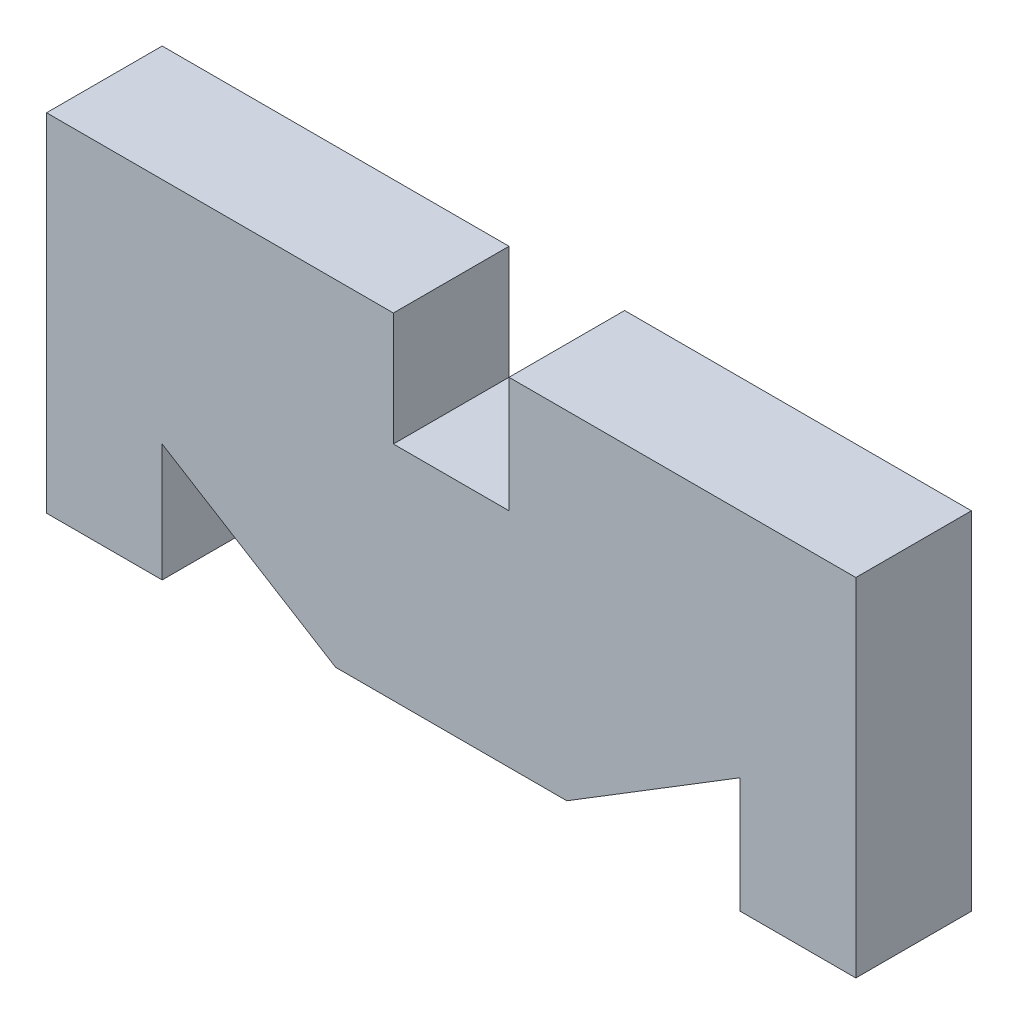
ISO-10303-21;
HEADER;
FILE_DESCRIPTION(('STEP AP214'),'2;1');
FILE_NAME('part.step','',(''),(''),'','','');
FILE_SCHEMA(('AUTOMOTIVE_DESIGN { 1 0 10303 214 1 1 1 1 }'));
ENDSEC;
DATA;
#1=APPLICATION_CONTEXT('core data for automotive mechanical design processes');
#2=APPLICATION_PROTOCOL_DEFINITION('international standard','automotive_design',2000,#1);
#3=PRODUCT_CONTEXT('',#1,'mechanical');
#4=PRODUCT('Part','Part','',(#3));
#5=PRODUCT_RELATED_PRODUCT_CATEGORY('part','',(#4));
#6=PRODUCT_DEFINITION_FORMATION('','',#4);
#7=PRODUCT_DEFINITION_CONTEXT('part definition',#1,'design');
#8=PRODUCT_DEFINITION('design','',#6,#7);
#9=PRODUCT_DEFINITION_SHAPE('','',#8);
#10=(LENGTH_UNIT() NAMED_UNIT(*) SI_UNIT(.MILLI.,.METRE.));
#11=(NAMED_UNIT(*) PLANE_ANGLE_UNIT() SI_UNIT($,.RADIAN.));
#12=(NAMED_UNIT(*) SI_UNIT($,.STERADIAN.) SOLID_ANGLE_UNIT());
#13=UNCERTAINTY_MEASURE_WITH_UNIT(LENGTH_MEASURE(1.E-05),#10,'distance_accuracy_value','');
#14=(GEOMETRIC_REPRESENTATION_CONTEXT(3) GLOBAL_UNCERTAINTY_ASSIGNED_CONTEXT((#13)) GLOBAL_UNIT_ASSIGNED_CONTEXT((#10,
#11,#12)) REPRESENTATION_CONTEXT('',''));
#15=CARTESIAN_POINT('',(0.,0.,0.));
#16=DIRECTION('',(0.,0.,1.));
#17=DIRECTION('',(1.,0.,0.));
#18=AXIS2_PLACEMENT_3D('',#15,#16,#17);
#19=CARTESIAN_POINT('',(1.84845443306429,-6.2813351961484,10.));
#20=DIRECTION('',(1.,0.,0.));
#21=DIRECTION('',(0.,0.,-1.));
#22=AXIS2_PLACEMENT_3D('',#19,#20,#21);
#23=PLANE('',#22);
#24=DIRECTION('',(0.,-1.,0.));
#25=VECTOR('',#24,1.);
#26=CARTESIAN_POINT('',(1.84845443306429,-6.2813351961484,0.));
#27=LINE('',#26,#25);
#28=CARTESIAN_POINT('',(1.84845443306429,23.7186648038516,0.));
#29=VERTEX_POINT('',#28);
#30=CARTESIAN_POINT('',(1.84845443306429,-6.2813351961484,0.));
#31=VERTEX_POINT('',#30);
#32=EDGE_CURVE('E173',#29,#31,#27,.T.);
#33=ORIENTED_EDGE('',*,*,#32,.T.);
#34=DIRECTION('',(0.,0.,-1.));
#35=VECTOR('',#34,1.);
#36=CARTESIAN_POINT('',(1.84845443306429,-6.2813351961484,10.));
#37=LINE('',#36,#35);
#38=CARTESIAN_POINT('',(1.84845443306429,-6.2813351961484,10.));
#39=VERTEX_POINT('',#38);
#40=EDGE_CURVE('E11',#39,#31,#37,.T.);
#41=ORIENTED_EDGE('',*,*,#40,.F.);
#42=DIRECTION('',(0.,-1.,0.));
#43=VECTOR('',#42,1.);
#44=CARTESIAN_POINT('',(1.84845443306429,-6.2813351961484,10.));
#45=LINE('',#44,#43);
#46=CARTESIAN_POINT('',(1.84845443306429,23.7186648038516,10.));
#47=VERTEX_POINT('',#46);
#48=EDGE_CURVE('E197',#47,#39,#45,.T.);
#49=ORIENTED_EDGE('',*,*,#48,.F.);
#50=DIRECTION('',(0.,0.,-1.));
#51=VECTOR('',#50,1.);
#52=CARTESIAN_POINT('',(1.84845443306429,23.7186648038516,10.));
#53=LINE('',#52,#51);
#54=EDGE_CURVE('E167',#47,#29,#53,.T.);
#55=ORIENTED_EDGE('',*,*,#54,.T.);
#56=EDGE_LOOP('',(#33,#41,#49,#55));
#57=FACE_BOUND('',#56,.T.);
#58=ADVANCED_FACE('F39',(#57),#23,.F.);
#59=CARTESIAN_POINT('',(11.8484544330643,-6.2813351961484,10.));
#60=DIRECTION('',(0.,1.,0.));
#61=DIRECTION('',(-1.,0.,0.));
#62=AXIS2_PLACEMENT_3D('',#59,#60,#61);
#63=PLANE('',#62);
#64=DIRECTION('',(1.,0.,0.));
#65=VECTOR('',#64,1.);
#66=CARTESIAN_POINT('',(11.8484544330643,-6.2813351961484,0.));
#67=LINE('',#66,#65);
#68=CARTESIAN_POINT('',(11.8484544330643,-6.2813351961484,0.));
#69=VERTEX_POINT('',#68);
#70=EDGE_CURVE('E174',#31,#69,#67,.T.);
#71=ORIENTED_EDGE('',*,*,#70,.T.);
#72=DIRECTION('',(0.,0.,-1.));
#73=VECTOR('',#72,1.);
#74=CARTESIAN_POINT('',(11.8484544330643,-6.2813351961484,10.));
#75=LINE('',#74,#73);
#76=CARTESIAN_POINT('',(11.8484544330643,-6.2813351961484,10.));
#77=VERTEX_POINT('',#76);
#78=EDGE_CURVE('E50',#77,#69,#75,.T.);
#79=ORIENTED_EDGE('',*,*,#78,.F.);
#80=DIRECTION('',(1.,0.,0.));
#81=VECTOR('',#80,1.);
#82=CARTESIAN_POINT('',(11.8484544330643,-6.2813351961484,10.));
#83=LINE('',#82,#81);
#84=EDGE_CURVE('E116',#39,#77,#83,.T.);
#85=ORIENTED_EDGE('',*,*,#84,.F.);
#86=ORIENTED_EDGE('',*,*,#40,.T.);
#87=EDGE_LOOP('',(#71,#79,#85,#86));
#88=FACE_BOUND('',#87,.T.);
#89=ADVANCED_FACE('F283',(#88),#63,.F.);
#90=CARTESIAN_POINT('',(11.8484544330643,3.90407855986979,10.));
#91=DIRECTION('',(-1.,0.,0.));
#92=DIRECTION('',(0.,-1.,0.));
#93=AXIS2_PLACEMENT_3D('',#90,#91,#92);
#94=PLANE('',#93);
#95=DIRECTION('',(0.,1.,0.));
#96=VECTOR('',#95,1.);
#97=CARTESIAN_POINT('',(11.8484544330643,3.90407855986979,0.));
#98=LINE('',#97,#96);
#99=CARTESIAN_POINT('',(11.8484544330643,3.90407855986979,0.));
#100=VERTEX_POINT('',#99);
#101=EDGE_CURVE('E176',#69,#100,#98,.T.);
#102=ORIENTED_EDGE('',*,*,#101,.T.);
#103=DIRECTION('',(0.,0.,-1.));
#104=VECTOR('',#103,1.);
#105=CARTESIAN_POINT('',(11.8484544330643,3.90407855986979,10.));
#106=LINE('',#105,#104);
#107=CARTESIAN_POINT('',(11.8484544330643,3.90407855986979,10.));
#108=VERTEX_POINT('',#107);
#109=EDGE_CURVE('E225',#108,#100,#106,.T.);
#110=ORIENTED_EDGE('',*,*,#109,.F.);
#111=DIRECTION('',(0.,1.,0.));
#112=VECTOR('',#111,1.);
#113=CARTESIAN_POINT('',(11.8484544330643,3.90407855986979,10.));
#114=LINE('',#113,#112);
#115=EDGE_CURVE('E229',#77,#108,#114,.T.);
#116=ORIENTED_EDGE('',*,*,#115,.F.);
#117=ORIENTED_EDGE('',*,*,#78,.T.);
#118=EDGE_LOOP('',(#102,#110,#116,#117));
#119=FACE_BOUND('',#118,.T.);
#120=ADVANCED_FACE('F228',(#119),#94,.F.);
#121=CARTESIAN_POINT('',(26.8484544330643,-5.32163250947317,10.));
#122=DIRECTION('',(0.523889074635762,0.851786497590379,0.));
#123=DIRECTION('',(-0.851786497590379,0.523889074635762,0.));
#124=AXIS2_PLACEMENT_3D('',#121,#122,#123);
#125=PLANE('',#124);
#126=DIRECTION('',(0.851786497590379,-0.523889074635762,0.));
#127=VECTOR('',#126,1.);
#128=CARTESIAN_POINT('',(26.8484544330643,-5.32163250947317,0.));
#129=LINE('',#128,#127);
#130=CARTESIAN_POINT('',(26.8484544330643,-5.32163250947317,0.));
#131=VERTEX_POINT('',#130);
#132=EDGE_CURVE('E178',#100,#131,#129,.T.);
#133=ORIENTED_EDGE('',*,*,#132,.T.);
#134=DIRECTION('',(0.,0.,-1.));
#135=VECTOR('',#134,1.);
#136=CARTESIAN_POINT('',(26.8484544330643,-5.32163250947317,10.));
#137=LINE('',#136,#135);
#138=CARTESIAN_POINT('',(26.8484544330643,-5.32163250947317,10.));
#139=VERTEX_POINT('',#138);
#140=EDGE_CURVE('E219',#139,#131,#137,.T.);
#141=ORIENTED_EDGE('',*,*,#140,.F.);
#142=DIRECTION('',(0.851786497590379,-0.523889074635762,0.));
#143=VECTOR('',#142,1.);
#144=CARTESIAN_POINT('',(26.8484544330643,-5.32163250947317,10.));
#145=LINE('',#144,#143);
#146=EDGE_CURVE('E246',#108,#139,#145,.T.);
#147=ORIENTED_EDGE('',*,*,#146,.F.);
#148=ORIENTED_EDGE('',*,*,#109,.T.);
#149=EDGE_LOOP('',(#133,#141,#147,#148));
#150=FACE_BOUND('',#149,.T.);
#151=ADVANCED_FACE('F236',(#150),#125,.F.);
#152=CARTESIAN_POINT('',(46.8484544330643,-5.32163250947316,10.));
#153=DIRECTION('',(0.,1.,0.));
#154=DIRECTION('',(-1.,0.,0.));
#155=AXIS2_PLACEMENT_3D('',#152,#153,#154);
#156=PLANE('',#155);
#157=DIRECTION('',(1.,0.,0.));
#158=VECTOR('',#157,1.);
#159=CARTESIAN_POINT('',(46.8484544330643,-5.32163250947316,0.));
#160=LINE('',#159,#158);
#161=CARTESIAN_POINT('',(46.8484544330643,-5.32163250947316,0.));
#162=VERTEX_POINT('',#161);
#163=EDGE_CURVE('E179',#131,#162,#160,.T.);
#164=ORIENTED_EDGE('',*,*,#163,.T.);
#165=DIRECTION('',(0.,0.,-1.));
#166=VECTOR('',#165,1.);
#167=CARTESIAN_POINT('',(46.8484544330643,-5.32163250947316,10.));
#168=LINE('',#167,#166);
#169=CARTESIAN_POINT('',(46.8484544330643,-5.32163250947316,10.));
#170=VERTEX_POINT('',#169);
#171=EDGE_CURVE('E218',#170,#162,#168,.T.);
#172=ORIENTED_EDGE('',*,*,#171,.F.);
#173=DIRECTION('',(1.,0.,0.));
#174=VECTOR('',#173,1.);
#175=CARTESIAN_POINT('',(46.8484544330643,-5.32163250947316,10.));
#176=LINE('',#175,#174);
#177=EDGE_CURVE('E245',#139,#170,#176,.T.);
#178=ORIENTED_EDGE('',*,*,#177,.F.);
#179=ORIENTED_EDGE('',*,*,#140,.T.);
#180=EDGE_LOOP('',(#164,#172,#178,#179));
#181=FACE_BOUND('',#180,.T.);
#182=ADVANCED_FACE('F244',(#181),#156,.F.);
#183=CARTESIAN_POINT('',(61.8484544330643,3.90407855986973,10.));
#184=DIRECTION('',(-0.523889074635759,0.851786497590381,0.));
#185=DIRECTION('',(-0.851786497590381,-0.523889074635759,0.));
#186=AXIS2_PLACEMENT_3D('',#183,#184,#185);
#187=PLANE('',#186);
#188=DIRECTION('',(0.851786497590381,0.523889074635759,0.));
#189=VECTOR('',#188,1.);
#190=CARTESIAN_POINT('',(61.8484544330643,3.90407855986973,0.));
#191=LINE('',#190,#189);
#192=CARTESIAN_POINT('',(61.8484544330643,3.90407855986973,0.));
#193=VERTEX_POINT('',#192);
#194=EDGE_CURVE('E185',#162,#193,#191,.T.);
#195=ORIENTED_EDGE('',*,*,#194,.T.);
#196=DIRECTION('',(0.,0.,-1.));
#197=VECTOR('',#196,1.);
#198=CARTESIAN_POINT('',(61.8484544330643,3.90407855986973,10.));
#199=LINE('',#198,#197);
#200=CARTESIAN_POINT('',(61.8484544330643,3.90407855986973,10.));
#201=VERTEX_POINT('',#200);
#202=EDGE_CURVE('E211',#201,#193,#199,.T.);
#203=ORIENTED_EDGE('',*,*,#202,.F.);
#204=DIRECTION('',(0.851786497590381,0.523889074635759,0.));
#205=VECTOR('',#204,1.);
#206=CARTESIAN_POINT('',(61.8484544330643,3.90407855986973,10.));
#207=LINE('',#206,#205);
#208=EDGE_CURVE('E250',#170,#201,#207,.T.);
#209=ORIENTED_EDGE('',*,*,#208,.F.);
#210=ORIENTED_EDGE('',*,*,#171,.T.);
#211=EDGE_LOOP('',(#195,#203,#209,#210));
#212=FACE_BOUND('',#211,.T.);
#213=ADVANCED_FACE('F299',(#212),#187,.F.);
#214=CARTESIAN_POINT('',(61.8484544330643,-6.09592144013027,10.));
#215=DIRECTION('',(1.,0.,0.));
#216=DIRECTION('',(0.,0.,-1.));
#217=AXIS2_PLACEMENT_3D('',#214,#215,#216);
#218=PLANE('',#217);
#219=DIRECTION('',(0.,-1.,0.));
#220=VECTOR('',#219,1.);
#221=CARTESIAN_POINT('',(61.8484544330643,-6.09592144013027,0.));
#222=LINE('',#221,#220);
#223=CARTESIAN_POINT('',(61.8484544330643,-6.09592144013027,0.));
#224=VERTEX_POINT('',#223);
#225=EDGE_CURVE('E182',#193,#224,#222,.T.);
#226=ORIENTED_EDGE('',*,*,#225,.T.);
#227=DIRECTION('',(0.,0.,-1.));
#228=VECTOR('',#227,1.);
#229=CARTESIAN_POINT('',(61.8484544330643,-6.09592144013027,10.));
#230=LINE('',#229,#228);
#231=CARTESIAN_POINT('',(61.8484544330643,-6.09592144013027,10.));
#232=VERTEX_POINT('',#231);
#233=EDGE_CURVE('E210',#232,#224,#230,.T.);
#234=ORIENTED_EDGE('',*,*,#233,.F.);
#235=DIRECTION('',(0.,-1.,0.));
#236=VECTOR('',#235,1.);
#237=CARTESIAN_POINT('',(61.8484544330643,-6.09592144013027,10.));
#238=LINE('',#237,#236);
#239=EDGE_CURVE('E248',#201,#232,#238,.T.);
#240=ORIENTED_EDGE('',*,*,#239,.F.);
#241=ORIENTED_EDGE('',*,*,#202,.T.);
#242=EDGE_LOOP('',(#226,#234,#240,#241));
#243=FACE_BOUND('',#242,.T.);
#244=ADVANCED_FACE('F303',(#243),#218,.F.);
#245=CARTESIAN_POINT('',(71.8484544330643,-6.09592144013027,10.));
#246=DIRECTION('',(0.,1.,0.));
#247=DIRECTION('',(-1.,0.,0.));
#248=AXIS2_PLACEMENT_3D('',#245,#246,#247);
#249=PLANE('',#248);
#250=DIRECTION('',(1.,0.,0.));
#251=VECTOR('',#250,1.);
#252=CARTESIAN_POINT('',(71.8484544330643,-6.09592144013027,0.));
#253=LINE('',#252,#251);
#254=CARTESIAN_POINT('',(71.8484544330643,-6.09592144013027,0.));
#255=VERTEX_POINT('',#254);
#256=EDGE_CURVE('E186',#224,#255,#253,.T.);
#257=ORIENTED_EDGE('',*,*,#256,.T.);
#258=DIRECTION('',(0.,0.,-1.));
#259=VECTOR('',#258,1.);
#260=CARTESIAN_POINT('',(71.8484544330643,-6.09592144013027,10.));
#261=LINE('',#260,#259);
#262=CARTESIAN_POINT('',(71.8484544330643,-6.09592144013027,10.));
#263=VERTEX_POINT('',#262);
#264=EDGE_CURVE('E207',#263,#255,#261,.T.);
#265=ORIENTED_EDGE('',*,*,#264,.F.);
#266=DIRECTION('',(1.,0.,0.));
#267=VECTOR('',#266,1.);
#268=CARTESIAN_POINT('',(71.8484544330643,-6.09592144013027,10.));
#269=LINE('',#268,#267);
#270=EDGE_CURVE('E258',#232,#263,#269,.T.);
#271=ORIENTED_EDGE('',*,*,#270,.F.);
#272=ORIENTED_EDGE('',*,*,#233,.T.);
#273=EDGE_LOOP('',(#257,#265,#271,#272));
#274=FACE_BOUND('',#273,.T.);
#275=ADVANCED_FACE('F304',(#274),#249,.F.);
#276=CARTESIAN_POINT('',(71.8484544330643,23.9040785598697,10.));
#277=DIRECTION('',(-1.,0.,0.));
#278=DIRECTION('',(0.,0.,1.));
#279=AXIS2_PLACEMENT_3D('',#276,#277,#278);
#280=PLANE('',#279);
#281=DIRECTION('',(0.,1.,0.));
#282=VECTOR('',#281,1.);
#283=CARTESIAN_POINT('',(71.8484544330643,23.9040785598697,0.));
#284=LINE('',#283,#282);
#285=CARTESIAN_POINT('',(71.8484544330643,23.9040785598697,0.));
#286=VERTEX_POINT('',#285);
#287=EDGE_CURVE('E187',#255,#286,#284,.T.);
#288=ORIENTED_EDGE('',*,*,#287,.T.);
#289=DIRECTION('',(0.,0.,-1.));
#290=VECTOR('',#289,1.);
#291=CARTESIAN_POINT('',(71.8484544330643,23.9040785598697,10.));
#292=LINE('',#291,#290);
#293=CARTESIAN_POINT('',(71.8484544330643,23.9040785598697,10.));
#294=VERTEX_POINT('',#293);
#295=EDGE_CURVE('E204',#294,#286,#292,.T.);
#296=ORIENTED_EDGE('',*,*,#295,.F.);
#297=DIRECTION('',(0.,1.,0.));
#298=VECTOR('',#297,1.);
#299=CARTESIAN_POINT('',(71.8484544330643,23.9040785598697,10.));
#300=LINE('',#299,#298);
#301=EDGE_CURVE('E256',#263,#294,#300,.T.);
#302=ORIENTED_EDGE('',*,*,#301,.F.);
#303=ORIENTED_EDGE('',*,*,#264,.T.);
#304=EDGE_LOOP('',(#288,#296,#302,#303));
#305=FACE_BOUND('',#304,.T.);
#306=ADVANCED_FACE('F309',(#305),#280,.F.);
#307=CARTESIAN_POINT('',(41.8484544330643,23.9040785598697,10.));
#308=DIRECTION('',(0.,-1.,0.));
#309=DIRECTION('',(1.,0.,0.));
#310=AXIS2_PLACEMENT_3D('',#307,#308,#309);
#311=PLANE('',#310);
#312=DIRECTION('',(-1.,0.,0.));
#313=VECTOR('',#312,1.);
#314=CARTESIAN_POINT('',(41.8484544330643,23.9040785598697,0.));
#315=LINE('',#314,#313);
#316=CARTESIAN_POINT('',(41.8484544330643,23.9040785598697,0.));
#317=VERTEX_POINT('',#316);
#318=EDGE_CURVE('E189',#286,#317,#315,.T.);
#319=ORIENTED_EDGE('',*,*,#318,.T.);
#320=DIRECTION('',(0.,0.,-1.));
#321=VECTOR('',#320,1.);
#322=CARTESIAN_POINT('',(41.8484544330643,23.9040785598697,10.));
#323=LINE('',#322,#321);
#324=CARTESIAN_POINT('',(41.8484544330643,23.9040785598697,10.));
#325=VERTEX_POINT('',#324);
#326=EDGE_CURVE('E202',#325,#317,#323,.T.);
#327=ORIENTED_EDGE('',*,*,#326,.F.);
#328=DIRECTION('',(-1.,0.,0.));
#329=VECTOR('',#328,1.);
#330=CARTESIAN_POINT('',(41.8484544330643,23.9040785598697,10.));
#331=LINE('',#330,#329);
#332=EDGE_CURVE('E259',#294,#325,#331,.T.);
#333=ORIENTED_EDGE('',*,*,#332,.F.);
#334=ORIENTED_EDGE('',*,*,#295,.T.);
#335=EDGE_LOOP('',(#319,#327,#333,#334));
#336=FACE_BOUND('',#335,.T.);
#337=ADVANCED_FACE('F266',(#336),#311,.F.);
#338=CARTESIAN_POINT('',(41.8484544330643,13.9040785598697,10.));
#339=DIRECTION('',(1.,0.,0.));
#340=DIRECTION('',(0.,1.,0.));
#341=AXIS2_PLACEMENT_3D('',#338,#339,#340);
#342=PLANE('',#341);
#343=DIRECTION('',(0.,-1.,0.));
#344=VECTOR('',#343,1.);
#345=CARTESIAN_POINT('',(41.8484544330643,13.9040785598697,0.));
#346=LINE('',#345,#344);
#347=CARTESIAN_POINT('',(41.8484544330643,13.9040785598697,0.));
#348=VERTEX_POINT('',#347);
#349=EDGE_CURVE('E195',#317,#348,#346,.T.);
#350=ORIENTED_EDGE('',*,*,#349,.T.);
#351=DIRECTION('',(0.,0.,-1.));
#352=VECTOR('',#351,1.);
#353=CARTESIAN_POINT('',(41.8484544330643,13.9040785598697,10.));
#354=LINE('',#353,#352);
#355=CARTESIAN_POINT('',(41.8484544330643,13.9040785598697,10.));
#356=VERTEX_POINT('',#355);
#357=EDGE_CURVE('E162',#356,#348,#354,.T.);
#358=ORIENTED_EDGE('',*,*,#357,.F.);
#359=DIRECTION('',(0.,-1.,0.));
#360=VECTOR('',#359,1.);
#361=CARTESIAN_POINT('',(41.8484544330643,13.9040785598697,10.));
#362=LINE('',#361,#360);
#363=EDGE_CURVE('E154',#325,#356,#362,.T.);
#364=ORIENTED_EDGE('',*,*,#363,.F.);
#365=ORIENTED_EDGE('',*,*,#326,.T.);
#366=EDGE_LOOP('',(#350,#358,#364,#365));
#367=FACE_BOUND('',#366,.T.);
#368=ADVANCED_FACE('F269',(#367),#342,.F.);
#369=CARTESIAN_POINT('',(31.8484544330643,13.9040785598697,10.));
#370=DIRECTION('',(0.,-1.,0.));
#371=DIRECTION('',(1.,0.,0.));
#372=AXIS2_PLACEMENT_3D('',#369,#370,#371);
#373=PLANE('',#372);
#374=DIRECTION('',(-1.,0.,0.));
#375=VECTOR('',#374,1.);
#376=CARTESIAN_POINT('',(31.8484544330643,13.9040785598697,0.));
#377=LINE('',#376,#375);
#378=CARTESIAN_POINT('',(31.8484544330643,13.9040785598697,0.));
#379=VERTEX_POINT('',#378);
#380=EDGE_CURVE('E161',#348,#379,#377,.T.);
#381=ORIENTED_EDGE('',*,*,#380,.T.);
#382=DIRECTION('',(0.,0.,-1.));
#383=VECTOR('',#382,1.);
#384=CARTESIAN_POINT('',(31.8484544330643,13.9040785598697,10.));
#385=LINE('',#384,#383);
#386=CARTESIAN_POINT('',(31.8484544330643,13.9040785598697,10.));
#387=VERTEX_POINT('',#386);
#388=EDGE_CURVE('E156',#387,#379,#385,.T.);
#389=ORIENTED_EDGE('',*,*,#388,.F.);
#390=DIRECTION('',(-1.,0.,0.));
#391=VECTOR('',#390,1.);
#392=CARTESIAN_POINT('',(31.8484544330643,13.9040785598697,10.));
#393=LINE('',#392,#391);
#394=EDGE_CURVE('E150',#356,#387,#393,.T.);
#395=ORIENTED_EDGE('',*,*,#394,.F.);
#396=ORIENTED_EDGE('',*,*,#357,.T.);
#397=EDGE_LOOP('',(#381,#389,#395,#396));
#398=FACE_BOUND('',#397,.T.);
#399=ADVANCED_FACE('F159',(#398),#373,.F.);
#400=CARTESIAN_POINT('',(31.8484544330643,23.7186648038516,10.));
#401=DIRECTION('',(-1.,0.,0.));
#402=DIRECTION('',(0.,-1.,0.));
#403=AXIS2_PLACEMENT_3D('',#400,#401,#402);
#404=PLANE('',#403);
#405=DIRECTION('',(0.,1.,0.));
#406=VECTOR('',#405,1.);
#407=CARTESIAN_POINT('',(31.8484544330643,23.7186648038516,0.));
#408=LINE('',#407,#406);
#409=CARTESIAN_POINT('',(31.8484544330643,23.7186648038516,0.));
#410=VERTEX_POINT('',#409);
#411=EDGE_CURVE('E105',#379,#410,#408,.T.);
#412=ORIENTED_EDGE('',*,*,#411,.T.);
#413=DIRECTION('',(0.,0.,-1.));
#414=VECTOR('',#413,1.);
#415=CARTESIAN_POINT('',(31.8484544330643,23.7186648038516,10.));
#416=LINE('',#415,#414);
#417=CARTESIAN_POINT('',(31.8484544330643,23.7186648038516,10.));
#418=VERTEX_POINT('',#417);
#419=EDGE_CURVE('E164',#418,#410,#416,.T.);
#420=ORIENTED_EDGE('',*,*,#419,.F.);
#421=DIRECTION('',(0.,1.,0.));
#422=VECTOR('',#421,1.);
#423=CARTESIAN_POINT('',(31.8484544330643,23.7186648038516,10.));
#424=LINE('',#423,#422);
#425=EDGE_CURVE('E151',#387,#418,#424,.T.);
#426=ORIENTED_EDGE('',*,*,#425,.F.);
#427=ORIENTED_EDGE('',*,*,#388,.T.);
#428=EDGE_LOOP('',(#412,#420,#426,#427));
#429=FACE_BOUND('',#428,.T.);
#430=ADVANCED_FACE('F165',(#429),#404,.F.);
#431=CARTESIAN_POINT('',(1.84845443306429,23.7186648038516,10.));
#432=DIRECTION('',(0.,-1.,0.));
#433=DIRECTION('',(1.,0.,0.));
#434=AXIS2_PLACEMENT_3D('',#431,#432,#433);
#435=PLANE('',#434);
#436=DIRECTION('',(-1.,0.,0.));
#437=VECTOR('',#436,1.);
#438=CARTESIAN_POINT('',(1.84845443306429,23.7186648038516,0.));
#439=LINE('',#438,#437);
#440=EDGE_CURVE('E109',#410,#29,#439,.T.);
#441=ORIENTED_EDGE('',*,*,#440,.T.);
#442=ORIENTED_EDGE('',*,*,#54,.F.);
#443=DIRECTION('',(-1.,0.,0.));
#444=VECTOR('',#443,1.);
#445=CARTESIAN_POINT('',(1.84845443306429,23.7186648038516,10.));
#446=LINE('',#445,#444);
#447=EDGE_CURVE('E54',#418,#47,#446,.T.);
#448=ORIENTED_EDGE('',*,*,#447,.F.);
#449=ORIENTED_EDGE('',*,*,#419,.T.);
#450=EDGE_LOOP('',(#441,#442,#448,#449));
#451=FACE_BOUND('',#450,.T.);
#452=ADVANCED_FACE('F272',(#451),#435,.F.);
#453=CARTESIAN_POINT('',(0.,0.,10.));
#454=DIRECTION('',(0.,0.,-1.));
#455=DIRECTION('',(-1.,0.,0.));
#456=AXIS2_PLACEMENT_3D('',#453,#454,#455);
#457=PLANE('',#456);
#458=ORIENTED_EDGE('',*,*,#48,.T.);
#459=ORIENTED_EDGE('',*,*,#84,.T.);
#460=ORIENTED_EDGE('',*,*,#115,.T.);
#461=ORIENTED_EDGE('',*,*,#146,.T.);
#462=ORIENTED_EDGE('',*,*,#177,.T.);
#463=ORIENTED_EDGE('',*,*,#208,.T.);
#464=ORIENTED_EDGE('',*,*,#239,.T.);
#465=ORIENTED_EDGE('',*,*,#270,.T.);
#466=ORIENTED_EDGE('',*,*,#301,.T.);
#467=ORIENTED_EDGE('',*,*,#332,.T.);
#468=ORIENTED_EDGE('',*,*,#363,.T.);
#469=ORIENTED_EDGE('',*,*,#394,.T.);
#470=ORIENTED_EDGE('',*,*,#425,.T.);
#471=ORIENTED_EDGE('',*,*,#447,.T.);
#472=EDGE_LOOP('',(#458,#459,#460,#461,#462,#463,#464,#465,#466,#467,#468,#469,#470,#471));
#473=FACE_BOUND('',#472,.T.);
#474=ADVANCED_FACE('F146',(#473),#457,.F.);
#475=CARTESIAN_POINT('',(0.,0.,0.));
#476=DIRECTION('',(0.,0.,-1.));
#477=DIRECTION('',(-1.,0.,0.));
#478=AXIS2_PLACEMENT_3D('',#475,#476,#477);
#479=PLANE('',#478);
#480=ORIENTED_EDGE('',*,*,#32,.F.);
#481=ORIENTED_EDGE('',*,*,#440,.F.);
#482=ORIENTED_EDGE('',*,*,#411,.F.);
#483=ORIENTED_EDGE('',*,*,#380,.F.);
#484=ORIENTED_EDGE('',*,*,#349,.F.);
#485=ORIENTED_EDGE('',*,*,#318,.F.);
#486=ORIENTED_EDGE('',*,*,#287,.F.);
#487=ORIENTED_EDGE('',*,*,#256,.F.);
#488=ORIENTED_EDGE('',*,*,#225,.F.);
#489=ORIENTED_EDGE('',*,*,#194,.F.);
#490=ORIENTED_EDGE('',*,*,#163,.F.);
#491=ORIENTED_EDGE('',*,*,#132,.F.);
#492=ORIENTED_EDGE('',*,*,#101,.F.);
#493=ORIENTED_EDGE('',*,*,#70,.F.);
#494=EDGE_LOOP('',(#480,#481,#482,#483,#484,#485,#486,#487,#488,#489,#490,#491,#492,#493));
#495=FACE_BOUND('',#494,.T.);
#496=ADVANCED_FACE('F233',(#495),#479,.T.);
#497=CLOSED_SHELL('',(#58,#89,#120,#151,#182,#213,#244,#275,#306,#337,#368,#399,#430,#452,#474,#496));
#498=MANIFOLD_SOLID_BREP('B2',#497);
#499=ADVANCED_BREP_SHAPE_REPRESENTATION('',(#18,#498),#14);
#500=SHAPE_DEFINITION_REPRESENTATION(#9,#499);
ENDSEC;
END-ISO-10303-21;
